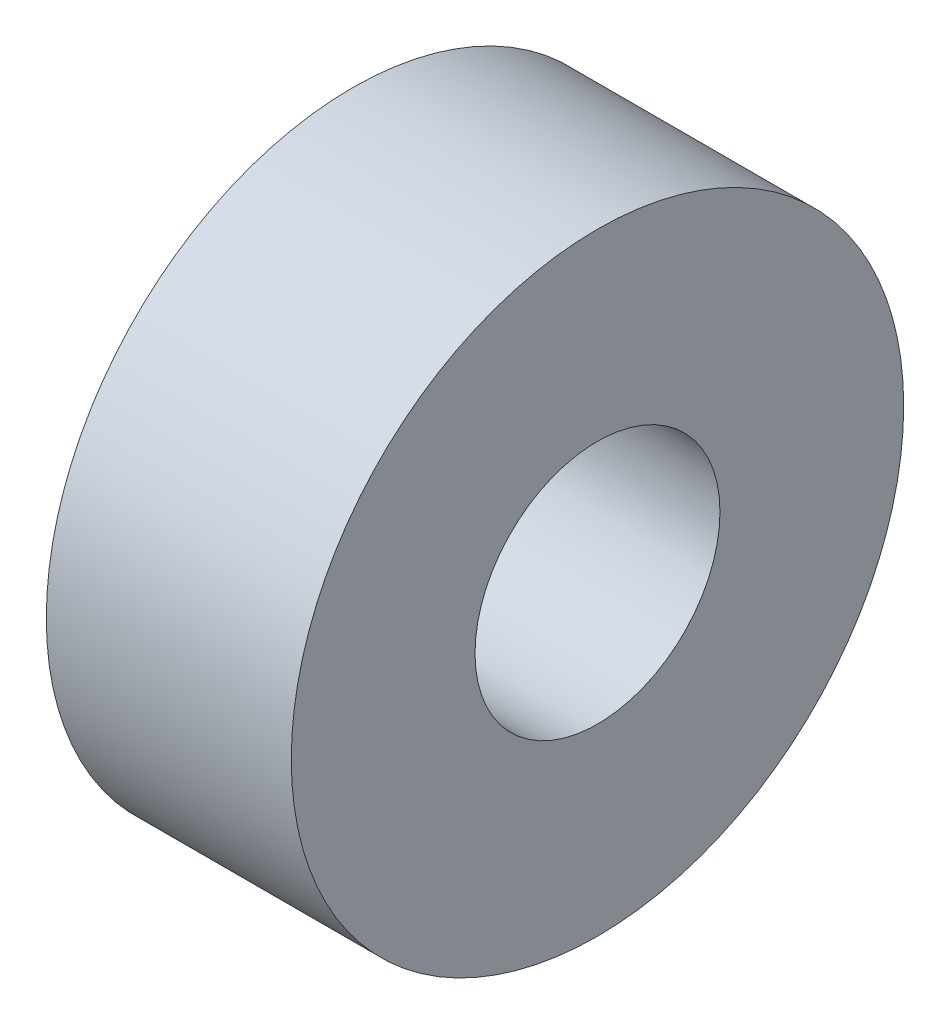
ISO-10303-21;
HEADER;
FILE_DESCRIPTION(('STEP AP214'),'2;1');
FILE_NAME('part.step','',(''),(''),'','','');
FILE_SCHEMA(('AUTOMOTIVE_DESIGN { 1 0 10303 214 1 1 1 1 }'));
ENDSEC;
DATA;
#1=APPLICATION_CONTEXT('core data for automotive mechanical design processes');
#2=APPLICATION_PROTOCOL_DEFINITION('international standard','automotive_design',2000,#1);
#3=PRODUCT_CONTEXT('',#1,'mechanical');
#4=PRODUCT('Part','Part','',(#3));
#5=PRODUCT_RELATED_PRODUCT_CATEGORY('part','',(#4));
#6=PRODUCT_DEFINITION_FORMATION('','',#4);
#7=PRODUCT_DEFINITION_CONTEXT('part definition',#1,'design');
#8=PRODUCT_DEFINITION('design','',#6,#7);
#9=PRODUCT_DEFINITION_SHAPE('','',#8);
#10=(LENGTH_UNIT() NAMED_UNIT(*) SI_UNIT(.MILLI.,.METRE.));
#11=(NAMED_UNIT(*) PLANE_ANGLE_UNIT() SI_UNIT($,.RADIAN.));
#12=(NAMED_UNIT(*) SI_UNIT($,.STERADIAN.) SOLID_ANGLE_UNIT());
#13=UNCERTAINTY_MEASURE_WITH_UNIT(LENGTH_MEASURE(1.E-05),#10,'distance_accuracy_value','');
#14=(GEOMETRIC_REPRESENTATION_CONTEXT(3) GLOBAL_UNCERTAINTY_ASSIGNED_CONTEXT((#13)) GLOBAL_UNIT_ASSIGNED_CONTEXT((#10,
#11,#12)) REPRESENTATION_CONTEXT('',''));
#15=CARTESIAN_POINT('',(0.,0.,0.));
#16=DIRECTION('',(0.,0.,1.));
#17=DIRECTION('',(1.,0.,0.));
#18=AXIS2_PLACEMENT_3D('',#15,#16,#17);
#19=CARTESIAN_POINT('',(12.7,0.,0.));
#20=DIRECTION('',(1.,0.,0.));
#21=DIRECTION('',(0.,0.,-1.));
#22=AXIS2_PLACEMENT_3D('',#19,#20,#21);
#23=PLANE('',#22);
#24=CARTESIAN_POINT('',(12.7,0.,0.));
#25=DIRECTION('',(1.,0.,0.));
#26=DIRECTION('',(0.,0.,-1.));
#27=AXIS2_PLACEMENT_3D('',#24,#25,#26);
#28=CIRCLE('',#27,15.875);
#29=CARTESIAN_POINT('',(12.7,0.,-15.875));
#30=VERTEX_POINT('',#29);
#31=EDGE_CURVE('E10',#30,#30,#28,.T.);
#32=ORIENTED_EDGE('',*,*,#31,.T.);
#33=EDGE_LOOP('',(#32));
#34=FACE_BOUND('',#33,.T.);
#35=CARTESIAN_POINT('',(12.7,0.,0.));
#36=DIRECTION('',(1.,0.,0.));
#37=DIRECTION('',(0.,0.,-1.));
#38=AXIS2_PLACEMENT_3D('',#35,#36,#37);
#39=CIRCLE('',#38,6.35);
#40=CARTESIAN_POINT('',(12.7,0.,-6.35));
#41=VERTEX_POINT('',#40);
#42=EDGE_CURVE('E52',#41,#41,#39,.T.);
#43=ORIENTED_EDGE('',*,*,#42,.F.);
#44=EDGE_LOOP('',(#43));
#45=FACE_BOUND('',#44,.T.);
#46=ADVANCED_FACE('F39',(#34,#45),#23,.T.);
#47=CARTESIAN_POINT('',(0.,0.,0.));
#48=DIRECTION('',(1.,0.,0.));
#49=DIRECTION('',(0.,0.,-1.));
#50=AXIS2_PLACEMENT_3D('',#47,#48,#49);
#51=PLANE('',#50);
#52=CARTESIAN_POINT('',(0.,0.,0.));
#53=DIRECTION('',(1.,0.,0.));
#54=DIRECTION('',(0.,0.,-1.));
#55=AXIS2_PLACEMENT_3D('',#52,#53,#54);
#56=CIRCLE('',#55,15.875);
#57=CARTESIAN_POINT('',(0.,0.,-15.875));
#58=VERTEX_POINT('',#57);
#59=EDGE_CURVE('E43',#58,#58,#56,.T.);
#60=ORIENTED_EDGE('',*,*,#59,.F.);
#61=EDGE_LOOP('',(#60));
#62=FACE_BOUND('',#61,.T.);
#63=CARTESIAN_POINT('',(0.,0.,0.));
#64=DIRECTION('',(1.,0.,0.));
#65=DIRECTION('',(0.,0.,-1.));
#66=AXIS2_PLACEMENT_3D('',#63,#64,#65);
#67=CIRCLE('',#66,6.35);
#68=CARTESIAN_POINT('',(0.,0.,-6.35));
#69=VERTEX_POINT('',#68);
#70=EDGE_CURVE('E54',#69,#69,#67,.T.);
#71=ORIENTED_EDGE('',*,*,#70,.T.);
#72=EDGE_LOOP('',(#71));
#73=FACE_BOUND('',#72,.T.);
#74=ADVANCED_FACE('F66',(#62,#73),#51,.F.);
#75=CARTESIAN_POINT('',(12.7,0.,0.));
#76=DIRECTION('',(-1.,0.,0.));
#77=DIRECTION('',(0.,0.,1.));
#78=AXIS2_PLACEMENT_3D('',#75,#76,#77);
#79=CYLINDRICAL_SURFACE('',#78,15.875);
#80=ORIENTED_EDGE('',*,*,#31,.F.);
#81=EDGE_LOOP('',(#80));
#82=FACE_BOUND('',#81,.T.);
#83=ORIENTED_EDGE('',*,*,#59,.T.);
#84=EDGE_LOOP('',(#83));
#85=FACE_BOUND('',#84,.T.);
#86=ADVANCED_FACE('F41',(#82,#85),#79,.T.);
#87=CARTESIAN_POINT('',(12.7,0.,0.));
#88=DIRECTION('',(-1.,0.,0.));
#89=DIRECTION('',(0.,0.,1.));
#90=AXIS2_PLACEMENT_3D('',#87,#88,#89);
#91=CYLINDRICAL_SURFACE('',#90,6.35);
#92=ORIENTED_EDGE('',*,*,#42,.T.);
#93=EDGE_LOOP('',(#92));
#94=FACE_BOUND('',#93,.T.);
#95=ORIENTED_EDGE('',*,*,#70,.F.);
#96=EDGE_LOOP('',(#95));
#97=FACE_BOUND('',#96,.T.);
#98=ADVANCED_FACE('F62',(#94,#97),#91,.F.);
#99=CLOSED_SHELL('',(#46,#74,#86,#98));
#100=MANIFOLD_SOLID_BREP('B2',#99);
#101=ADVANCED_BREP_SHAPE_REPRESENTATION('',(#18,#100),#14);
#102=SHAPE_DEFINITION_REPRESENTATION(#9,#101);
ENDSEC;
END-ISO-10303-21;
